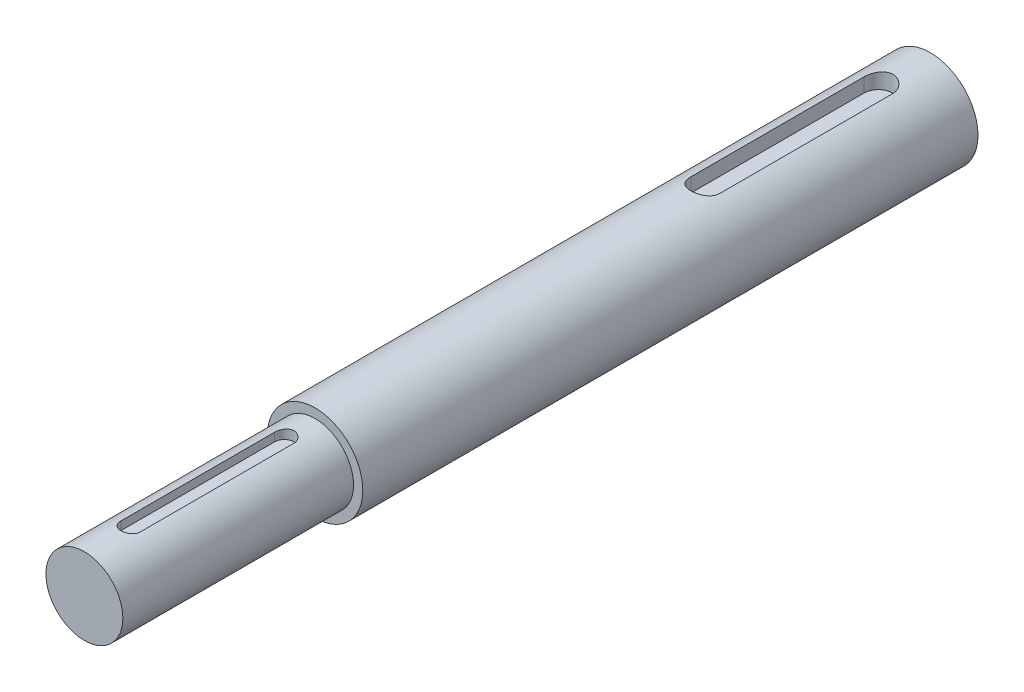
ISO-10303-21;
HEADER;
FILE_DESCRIPTION(('STEP AP214'),'2;1');
FILE_NAME('part.step','',(''),(''),'','','');
FILE_SCHEMA(('AUTOMOTIVE_DESIGN { 1 0 10303 214 1 1 1 1 }'));
ENDSEC;
DATA;
#1=APPLICATION_CONTEXT('core data for automotive mechanical design processes');
#2=APPLICATION_PROTOCOL_DEFINITION('international standard','automotive_design',2000,#1);
#3=PRODUCT_CONTEXT('',#1,'mechanical');
#4=PRODUCT('Part','Part','',(#3));
#5=PRODUCT_RELATED_PRODUCT_CATEGORY('part','',(#4));
#6=PRODUCT_DEFINITION_FORMATION('','',#4);
#7=PRODUCT_DEFINITION_CONTEXT('part definition',#1,'design');
#8=PRODUCT_DEFINITION('design','',#6,#7);
#9=PRODUCT_DEFINITION_SHAPE('','',#8);
#10=(LENGTH_UNIT() NAMED_UNIT(*) SI_UNIT(.MILLI.,.METRE.));
#11=(NAMED_UNIT(*) PLANE_ANGLE_UNIT() SI_UNIT($,.RADIAN.));
#12=(NAMED_UNIT(*) SI_UNIT($,.STERADIAN.) SOLID_ANGLE_UNIT());
#13=UNCERTAINTY_MEASURE_WITH_UNIT(LENGTH_MEASURE(1.E-05),#10,'distance_accuracy_value','');
#14=(GEOMETRIC_REPRESENTATION_CONTEXT(3) GLOBAL_UNCERTAINTY_ASSIGNED_CONTEXT((#13)) GLOBAL_UNIT_ASSIGNED_CONTEXT((#10,
#11,#12)) REPRESENTATION_CONTEXT('',''));
#15=CARTESIAN_POINT('',(0.,0.,0.));
#16=DIRECTION('',(0.,0.,1.));
#17=DIRECTION('',(1.,0.,0.));
#18=AXIS2_PLACEMENT_3D('',#15,#16,#17);
#19=CARTESIAN_POINT('',(0.,0.,101.6));
#20=DIRECTION('',(0.,0.,1.));
#21=DIRECTION('',(1.,0.,0.));
#22=AXIS2_PLACEMENT_3D('',#19,#20,#21);
#23=PLANE('',#22);
#24=CARTESIAN_POINT('',(0.,0.,101.6));
#25=DIRECTION('',(0.,0.,1.));
#26=DIRECTION('',(1.,0.,0.));
#27=AXIS2_PLACEMENT_3D('',#24,#25,#26);
#28=CIRCLE('',#27,7.874);
#29=CARTESIAN_POINT('',(7.874,0.,101.6));
#30=VERTEX_POINT('',#29);
#31=EDGE_CURVE('E160',#30,#30,#28,.T.);
#32=ORIENTED_EDGE('',*,*,#31,.T.);
#33=EDGE_LOOP('',(#32));
#34=FACE_BOUND('',#33,.T.);
#35=CARTESIAN_POINT('',(0.,0.,101.6));
#36=DIRECTION('',(0.,0.,1.));
#37=DIRECTION('',(1.,0.,0.));
#38=AXIS2_PLACEMENT_3D('',#35,#36,#37);
#39=CIRCLE('',#38,6.35);
#40=CARTESIAN_POINT('',(6.35,0.,101.6));
#41=VERTEX_POINT('',#40);
#42=EDGE_CURVE('E146',#41,#41,#39,.T.);
#43=ORIENTED_EDGE('',*,*,#42,.F.);
#44=EDGE_LOOP('',(#43));
#45=FACE_BOUND('',#44,.T.);
#46=ADVANCED_FACE('F33',(#34,#45),#23,.T.);
#47=CARTESIAN_POINT('',(0.,0.,101.6));
#48=DIRECTION('',(0.,0.,-1.));
#49=DIRECTION('',(-1.,0.,0.));
#50=AXIS2_PLACEMENT_3D('',#47,#48,#49);
#51=CYLINDRICAL_SURFACE('',#50,7.874);
#52=DIRECTION('',(0.,0.,-1.));
#53=VECTOR('',#52,1.);
#54=CARTESIAN_POINT('',(2.38760000000002,7.50328209785557,101.6));
#55=LINE('',#54,#53);
#56=CARTESIAN_POINT('',(2.38759999999999,7.50328209785557,8.57249999999998));
#57=VERTEX_POINT('',#56);
#58=CARTESIAN_POINT('',(2.3876,7.50328209785558,37.1475));
#59=VERTEX_POINT('',#58);
#60=EDGE_CURVE('E11',#57,#59,#55,.F.);
#61=ORIENTED_EDGE('',*,*,#60,.T.);
#62=CARTESIAN_POINT('',(2.3876,7.50328209785558,37.1475));
#63=CARTESIAN_POINT('',(2.38760821779032,7.50327284946534,37.2129924714623));
#64=CARTESIAN_POINT('',(2.38490544614134,7.5041393624445,37.2784796496773));
#65=CARTESIAN_POINT('',(2.37414186540394,7.50755516864404,37.4089534418565));
#66=CARTESIAN_POINT('',(2.36608228287681,7.51010407664164,37.4739401669656));
#67=CARTESIAN_POINT('',(2.34469646720921,7.51680736926332,37.6027878106993));
#68=CARTESIAN_POINT('',(2.33138381426518,7.52095761351674,37.6666511921733));
#69=CARTESIAN_POINT('',(2.29962310182442,7.53072930011945,37.7929560306487));
#70=CARTESIAN_POINT('',(2.28117490339136,7.53635078227114,37.8553974491311));
#71=CARTESIAN_POINT('',(2.21835513085229,7.55517779820655,38.0398958520454));
#72=CARTESIAN_POINT('',(2.16648047466429,7.57035520969243,38.1592932697437));
#73=CARTESIAN_POINT('',(2.04435037749231,7.60424223178625,38.3876922119953));
#74=CARTESIAN_POINT('',(1.97408612947307,7.6229535336257,38.4966887211836));
#75=CARTESIAN_POINT('',(1.81474110290773,7.6624740662912,38.7047415044754));
#76=CARTESIAN_POINT('',(1.72517203325727,7.68332851772332,38.8034159634566));
#77=CARTESIAN_POINT('',(1.53080549797222,7.72440052707145,38.984597829673));
#78=CARTESIAN_POINT('',(1.42600545305172,7.74461797640748,39.0671024930693));
#79=CARTESIAN_POINT('',(1.20140886411411,7.78265489473308,39.2152821923166));
#80=CARTESIAN_POINT('',(1.08134180176678,7.80041453439081,39.2805639485937));
#81=CARTESIAN_POINT('',(0.831308531995584,7.83100487402252,39.3898564593624));
#82=CARTESIAN_POINT('',(0.701344930688997,7.84383686628277,39.4338727915406));
#83=CARTESIAN_POINT('',(0.439227328358014,7.86280549607662,39.4981139389448));
#84=CARTESIAN_POINT('',(0.307247848406049,7.86912654438449,39.5189953920645));
#85=CARTESIAN_POINT('',(0.0415147230335115,7.87501105265659,39.5384514277847));
#86=CARTESIAN_POINT('',(-0.0922385734955804,7.87457582237881,39.5370303339095));
#87=CARTESIAN_POINT('',(-0.353106910261381,7.8671263990307,39.512359288386));
#88=CARTESIAN_POINT('',(-0.48029634865324,7.86032670086981,39.489821001924));
#89=CARTESIAN_POINT('',(-0.728992966857808,7.84117397116764,39.4247194938228));
#90=CARTESIAN_POINT('',(-0.850499846446754,7.82882064657952,39.3821552154715));
#91=CARTESIAN_POINT('',(-1.08606389447679,7.79965423557936,39.2777340502286));
#92=CARTESIAN_POINT('',(-1.20001608333464,7.78279018170079,39.2156551636257));
#93=CARTESIAN_POINT('',(-1.41611043440809,7.74638835600327,39.0741435906152));
#94=CARTESIAN_POINT('',(-1.51824988611004,7.72684997277789,38.9947069333819));
#95=CARTESIAN_POINT('',(-1.71205771472304,7.68628183698156,38.8170633649683));
#96=CARTESIAN_POINT('',(-1.80315767254702,7.66522364844163,38.7182420461265));
#97=CARTESIAN_POINT('',(-1.96767319770508,7.62465334817369,38.5064967796336));
#98=CARTESIAN_POINT('',(-2.04108356572079,7.60514169213007,38.3935687005009));
#99=CARTESIAN_POINT('',(-2.16875591718525,7.56973083959693,38.1552699542136));
#100=CARTESIAN_POINT('',(-2.22280884240702,7.55387170695431,38.0297811356253));
#101=CARTESIAN_POINT('',(-2.30877939213989,7.52804501355559,37.7709556554203));
#102=CARTESIAN_POINT('',(-2.34073095666729,7.51806842275062,37.6376313695369));
#103=CARTESIAN_POINT('',(-2.36989271220025,7.50889812752312,37.4437961254711));
#104=CARTESIAN_POINT('',(-2.376531989946,7.50679688788015,37.3847089971823));
#105=CARTESIAN_POINT('',(-2.38538176350181,7.50398861531597,37.266257954231));
#106=CARTESIAN_POINT('',(-2.38759870904082,7.50327955200574,37.2068945694086));
#107=CARTESIAN_POINT('',(-2.3876,7.50328209785558,37.1475));
#108=B_SPLINE_CURVE_WITH_KNOTS('',3,(#62,#63,#64,#65,#66,#67,#68,#69,#70,#71,#72,#73,#74,#75,
#76,#77,#78,#79,#80,#81,#82,#83,#84,#85,#86,#87,#88,#89,#90,#91,#92,#93,#94,#95,#96,#97,#98,#99,
#100,#101,#102,#103,#104,#105,#106,#107),.UNSPECIFIED.,.F.,.F.,(4,2,2,2,2,2,2,2,2,2,2,2,2,2,2,2,
2,2,2,2,2,2,4),(0.,0.196406928499266,0.392768900738741,0.588626530802149,0.784489460085461,
1.17571508325446,1.56712841384515,1.96993799986685,2.3728158792385,2.78422308642458,
3.19552232737019,3.59482217970918,3.99404462558367,4.38027911524776,4.76653398764498,
5.15735244591579,5.54826040299026,5.95451312940004,6.36088511622918,6.77152217630764,
7.18152723204413,7.35986407938129,7.53794064148895),.UNSPECIFIED.);
#109=CARTESIAN_POINT('',(-2.3876,7.50328209785558,37.1475));
#110=VERTEX_POINT('',#109);
#111=EDGE_CURVE('E315',#59,#110,#108,.T.);
#112=ORIENTED_EDGE('',*,*,#111,.T.);
#113=DIRECTION('',(0.,0.,-1.));
#114=VECTOR('',#113,1.);
#115=CARTESIAN_POINT('',(-2.38759999999998,7.50328209785558,101.6));
#116=LINE('',#115,#114);
#117=CARTESIAN_POINT('',(-2.38759999999998,7.50328209785558,8.57249999999998));
#118=VERTEX_POINT('',#117);
#119=EDGE_CURVE('E42',#110,#118,#116,.T.);
#120=ORIENTED_EDGE('',*,*,#119,.T.);
#121=CARTESIAN_POINT('',(-2.38760000000001,7.50328209785557,8.57249999999998));
#122=CARTESIAN_POINT('',(-2.38760821779033,7.50327284946534,8.5070075285377));
#123=CARTESIAN_POINT('',(-2.38490544614134,7.5041393624445,8.44152035032272));
#124=CARTESIAN_POINT('',(-2.37414186540394,7.50755516864404,8.31104655814348));
#125=CARTESIAN_POINT('',(-2.36608228287682,7.51010407664164,8.24605983303435));
#126=CARTESIAN_POINT('',(-2.34469646720921,7.51680736926332,8.11721218930066));
#127=CARTESIAN_POINT('',(-2.33138381426518,7.52095761351674,8.05334880782671));
#128=CARTESIAN_POINT('',(-2.29962310182442,7.53072930011945,7.92704396935129));
#129=CARTESIAN_POINT('',(-2.28117490339136,7.53635078227114,7.86460255086886));
#130=CARTESIAN_POINT('',(-2.21835513085229,7.55517779820655,7.68010414795462));
#131=CARTESIAN_POINT('',(-2.16648047466429,7.57035520969243,7.56070673025631));
#132=CARTESIAN_POINT('',(-2.04435037749231,7.60424223178625,7.33230778800467));
#133=CARTESIAN_POINT('',(-1.97408612947307,7.6229535336257,7.22331127881639));
#134=CARTESIAN_POINT('',(-1.81474110290773,7.6624740662912,7.01525849552461));
#135=CARTESIAN_POINT('',(-1.72517203325727,7.68332851772332,6.91658403654341));
#136=CARTESIAN_POINT('',(-1.53080549797222,7.72440052707145,6.73540217032696));
#137=CARTESIAN_POINT('',(-1.42600545305172,7.74461797640748,6.65289750693067));
#138=CARTESIAN_POINT('',(-1.20140886411411,7.78265489473308,6.50471780768338));
#139=CARTESIAN_POINT('',(-1.08134180176678,7.80041453439081,6.43943605140633));
#140=CARTESIAN_POINT('',(-0.831308531995584,7.83100487402252,6.33014354063757));
#141=CARTESIAN_POINT('',(-0.701344930688998,7.84383686628277,6.28612720845938));
#142=CARTESIAN_POINT('',(-0.439227328358016,7.86280549607661,6.22188606105516));
#143=CARTESIAN_POINT('',(-0.30724784840605,7.86912654438448,6.20100460793547));
#144=CARTESIAN_POINT('',(-0.0415147230335111,7.87501105265659,6.18154857221531));
#145=CARTESIAN_POINT('',(0.0922385734955813,7.87457582237881,6.18296966609048));
#146=CARTESIAN_POINT('',(0.353106910261383,7.8671263990307,6.20764071161396));
#147=CARTESIAN_POINT('',(0.480296348653242,7.86032670086981,6.23017899807601));
#148=CARTESIAN_POINT('',(0.728992966857811,7.84117397116764,6.2952805061772));
#149=CARTESIAN_POINT('',(0.850499846446756,7.82882064657952,6.33784478452847));
#150=CARTESIAN_POINT('',(1.08606389447679,7.79965423557936,6.44226594977135));
#151=CARTESIAN_POINT('',(1.20001608333464,7.78279018170079,6.50434483637425));
#152=CARTESIAN_POINT('',(1.41611043440809,7.74638835600327,6.64585640938477));
#153=CARTESIAN_POINT('',(1.51824988611004,7.72684997277789,6.7252930666181));
#154=CARTESIAN_POINT('',(1.71205771472304,7.68628183698156,6.9029366350317));
#155=CARTESIAN_POINT('',(1.80315767254702,7.66522364844163,7.00175795387353));
#156=CARTESIAN_POINT('',(1.96767319770508,7.62465334817369,7.21350322036644));
#157=CARTESIAN_POINT('',(2.04108356572079,7.60514169213007,7.3264312994991));
#158=CARTESIAN_POINT('',(2.16875591718525,7.56973083959693,7.56473004578639));
#159=CARTESIAN_POINT('',(2.22280884240701,7.55387170695431,7.69021886437468));
#160=CARTESIAN_POINT('',(2.30877939213989,7.52804501355559,7.94904434457964));
#161=CARTESIAN_POINT('',(2.34073095666728,7.51806842275062,8.0823686304631));
#162=CARTESIAN_POINT('',(2.36989271220025,7.50889812752312,8.27620387452891));
#163=CARTESIAN_POINT('',(2.376531989946,7.50679688788016,8.33529100281767));
#164=CARTESIAN_POINT('',(2.38538176350181,7.50398861531597,8.453742045769));
#165=CARTESIAN_POINT('',(2.38759870904081,7.50327955200574,8.51310543059142));
#166=CARTESIAN_POINT('',(2.38759999999999,7.50328209785558,8.57249999999998));
#167=B_SPLINE_CURVE_WITH_KNOTS('',3,(#121,#122,#123,#124,#125,#126,#127,#128,#129,#130,#131,
#132,#133,#134,#135,#136,#137,#138,#139,#140,#141,#142,#143,#144,#145,#146,#147,#148,#149,#150,
#151,#152,#153,#154,#155,#156,#157,#158,#159,#160,#161,#162,#163,#164,#165,#166),.UNSPECIFIED.,
.F.,.F.,(4,2,2,2,2,2,2,2,2,2,2,2,2,2,2,2,2,2,2,2,2,2,4),(0.,0.196406928499268,0.392768900738746,
0.58862653080216,0.784489460085466,1.17571508325447,1.56712841384515,1.96993799986685,
2.3728158792385,2.78422308642458,3.19552232737019,3.59482217970918,3.99404462558367,
4.38027911524776,4.76653398764499,5.1573524459158,5.54826040299027,5.95451312940005,
6.36088511622918,6.77152217630764,7.18152723204413,7.35986407938129,7.53794064148895),.UNSPECIFIED.);
#168=EDGE_CURVE('E49',#118,#57,#167,.T.);
#169=ORIENTED_EDGE('',*,*,#168,.T.);
#170=EDGE_LOOP('',(#61,#112,#120,#169));
#171=FACE_BOUND('',#170,.T.);
#172=ORIENTED_EDGE('',*,*,#31,.F.);
#173=EDGE_LOOP('',(#172));
#174=FACE_BOUND('',#173,.T.);
#175=CARTESIAN_POINT('',(0.,0.,0.));
#176=DIRECTION('',(0.,0.,1.));
#177=DIRECTION('',(1.,0.,0.));
#178=AXIS2_PLACEMENT_3D('',#175,#176,#177);
#179=CIRCLE('',#178,7.874);
#180=CARTESIAN_POINT('',(7.874,0.,0.));
#181=VERTEX_POINT('',#180);
#182=EDGE_CURVE('E157',#181,#181,#179,.T.);
#183=ORIENTED_EDGE('',*,*,#182,.T.);
#184=EDGE_LOOP('',(#183));
#185=FACE_BOUND('',#184,.T.);
#186=ADVANCED_FACE('F35',(#171,#174,#185),#51,.T.);
#187=CARTESIAN_POINT('',(0.,0.,0.));
#188=DIRECTION('',(0.,0.,1.));
#189=DIRECTION('',(1.,0.,0.));
#190=AXIS2_PLACEMENT_3D('',#187,#188,#189);
#191=PLANE('',#190);
#192=ORIENTED_EDGE('',*,*,#182,.F.);
#193=EDGE_LOOP('',(#192));
#194=FACE_BOUND('',#193,.T.);
#195=ADVANCED_FACE('F203',(#194),#191,.F.);
#196=CARTESIAN_POINT('',(0.,0.,139.7));
#197=DIRECTION('',(0.,0.,-1.));
#198=DIRECTION('',(-1.,0.,0.));
#199=AXIS2_PLACEMENT_3D('',#196,#197,#198);
#200=CYLINDRICAL_SURFACE('',#199,6.35);
#201=DIRECTION('',(0.,0.,-1.));
#202=VECTOR('',#201,1.);
#203=CARTESIAN_POINT('',(1.58750000000001,6.14836106210427,139.7));
#204=LINE('',#203,#202);
#205=CARTESIAN_POINT('',(1.5875,6.14836106210427,106.68));
#206=VERTEX_POINT('',#205);
#207=CARTESIAN_POINT('',(1.5875,6.14836106210427,132.08));
#208=VERTEX_POINT('',#207);
#209=EDGE_CURVE('E322',#206,#208,#204,.F.);
#210=ORIENTED_EDGE('',*,*,#209,.T.);
#211=CARTESIAN_POINT('',(1.5875,6.14836106210427,132.08));
#212=CARTESIAN_POINT('',(1.58750053577508,6.14835810871031,132.123914988857));
#213=CARTESIAN_POINT('',(1.5856766092084,6.14883215794785,132.167808217541));
#214=CARTESIAN_POINT('',(1.57840568144076,6.15070373829612,132.255266406044));
#215=CARTESIAN_POINT('',(1.57295928989663,6.15210111401178,132.298831419853));
#216=CARTESIAN_POINT('',(1.55126569251976,6.15762216168135,132.428381912469));
#217=CARTESIAN_POINT('',(1.52966371608634,6.16307509998734,132.513477143715));
#218=CARTESIAN_POINT('',(1.4728794460437,6.17688983358454,132.678685419629));
#219=CARTESIAN_POINT('',(1.43769842861035,6.18525135551601,132.758798931663));
#220=CARTESIAN_POINT('',(1.35479691261607,6.20393625974203,132.912026924728));
#221=CARTESIAN_POINT('',(1.30707305157914,6.21426016790589,132.985139521777));
#222=CARTESIAN_POINT('',(1.19933159902707,6.23595816556865,133.123850912526));
#223=CARTESIAN_POINT('',(1.13909041419458,6.24734893258403,133.189273381915));
#224=CARTESIAN_POINT('',(1.00850030156954,6.26975353228957,133.309204567054));
#225=CARTESIAN_POINT('',(0.938149761172665,6.28076730449527,133.36371153828));
#226=CARTESIAN_POINT('',(0.788125327800202,6.30136189374656,133.46098371507));
#227=CARTESIAN_POINT('',(0.708335102780995,6.31092058682246,133.503574584875));
#228=CARTESIAN_POINT('',(0.542452862963151,6.32733599672809,133.574670515537));
#229=CARTESIAN_POINT('',(0.456362092231793,6.33419324527087,133.603178348576));
#230=CARTESIAN_POINT('',(0.282168772283708,6.34431516258141,133.644733651034));
#231=CARTESIAN_POINT('',(0.194142236179555,6.34764975230815,133.658082429971));
#232=CARTESIAN_POINT('',(0.0170382813946867,6.3505943306442,133.669886602325));
#233=CARTESIAN_POINT('',(-0.0720390037955496,6.35020478739593,133.66834386768));
#234=CARTESIAN_POINT('',(-0.246622082593184,6.34579689318106,133.650624932649));
#235=CARTESIAN_POINT('',(-0.332163264012003,6.3418592790031,133.634774296148));
#236=CARTESIAN_POINT('',(-0.499330203846373,6.33089174885437,133.589412971797));
#237=CARTESIAN_POINT('',(-0.58095578884806,6.3238616960657,133.55990167956));
#238=CARTESIAN_POINT('',(-0.738834066563934,6.30737558946855,133.487792966935));
#239=CARTESIAN_POINT('',(-0.815031436993547,6.29789815201245,133.445079511655));
#240=CARTESIAN_POINT('',(-0.959289152077628,6.27754563547797,133.347867781389));
#241=CARTESIAN_POINT('',(-1.02734826845511,6.26667034593953,133.293367730973));
#242=CARTESIAN_POINT('',(-1.15533390616221,6.24436086061299,133.172392227071));
#243=CARTESIAN_POINT('',(-1.21499170109841,6.23291950133326,133.105633526993));
#244=CARTESIAN_POINT('',(-1.32233920060813,6.21103292150861,132.962920086252));
#245=CARTESIAN_POINT('',(-1.37002562901402,6.20058797413252,132.886962836662));
#246=CARTESIAN_POINT('',(-1.45225247599145,6.18184904068292,132.727468863455));
#247=CARTESIAN_POINT('',(-1.48672076589603,6.17356693289505,132.643893549477));
#248=CARTESIAN_POINT('',(-1.54098998356159,6.160247058562,132.471926876136));
#249=CARTESIAN_POINT('',(-1.56081283787425,6.15520444346279,132.38354292995));
#250=CARTESIAN_POINT('',(-1.5778236083021,6.1508527395692,132.258661408045));
#251=CARTESIAN_POINT('',(-1.58145288065964,6.1499198043849,132.223002471149));
#252=CARTESIAN_POINT('',(-1.58628835284461,6.14867424201247,132.151568008519));
#253=CARTESIAN_POINT('',(-1.58749847297747,6.14836061123394,132.115792765671));
#254=CARTESIAN_POINT('',(-1.5875,6.14836106210428,132.08));
#255=B_SPLINE_CURVE_WITH_KNOTS('',3,(#211,#212,#213,#214,#215,#216,#217,#218,#219,#220,#221,
#222,#223,#224,#225,#226,#227,#228,#229,#230,#231,#232,#233,#234,#235,#236,#237,#238,#239,#240,
#241,#242,#243,#244,#245,#246,#247,#248,#249,#250,#251,#252,#253,#254),.UNSPECIFIED.,.F.,.F.,(4,
2,2,2,2,2,2,2,2,2,2,2,2,2,2,2,2,2,2,2,2,4),(0.,0.131661741914362,0.263301330909383,
0.525827566389991,0.788329135320231,1.0509011473787,1.31864401216689,1.58642963374344,
1.85794947018447,2.12941583787723,2.39538639405577,2.66132351682413,2.92135790948349,
3.18140380792891,3.4438035875247,3.7062429203087,3.97575769386084,4.24534614449784,
4.51638543255692,4.78701810469725,4.89451409847199,5.00183575024028),.UNSPECIFIED.);
#256=CARTESIAN_POINT('',(-1.5875,6.14836106210428,132.08));
#257=VERTEX_POINT('',#256);
#258=EDGE_CURVE('E163',#208,#257,#255,.T.);
#259=ORIENTED_EDGE('',*,*,#258,.T.);
#260=DIRECTION('',(0.,0.,-1.));
#261=VECTOR('',#260,1.);
#262=CARTESIAN_POINT('',(-1.58749999999999,6.14836106210428,139.7));
#263=LINE('',#262,#261);
#264=CARTESIAN_POINT('',(-1.58749999999999,6.14836106210428,106.68));
#265=VERTEX_POINT('',#264);
#266=EDGE_CURVE('E330',#257,#265,#263,.T.);
#267=ORIENTED_EDGE('',*,*,#266,.T.);
#268=CARTESIAN_POINT('',(-1.5875,6.14836106210427,106.68));
#269=CARTESIAN_POINT('',(-1.58750053577508,6.14835810871031,106.636085011143));
#270=CARTESIAN_POINT('',(-1.5856766092084,6.14883215794785,106.592191782459));
#271=CARTESIAN_POINT('',(-1.57840568144076,6.15070373829612,106.504733593956));
#272=CARTESIAN_POINT('',(-1.57295928989663,6.15210111401178,106.461168580147));
#273=CARTESIAN_POINT('',(-1.55126569251976,6.15762216168135,106.331618087531));
#274=CARTESIAN_POINT('',(-1.52966371608633,6.16307509998734,106.246522856284));
#275=CARTESIAN_POINT('',(-1.4728794460437,6.17688983358454,106.081314580371));
#276=CARTESIAN_POINT('',(-1.43769842861034,6.18525135551601,106.001201068337));
#277=CARTESIAN_POINT('',(-1.35479691261606,6.20393625974203,105.847973075272));
#278=CARTESIAN_POINT('',(-1.30707305157913,6.21426016790589,105.774860478223));
#279=CARTESIAN_POINT('',(-1.19933159902705,6.23595816556865,105.636149087474));
#280=CARTESIAN_POINT('',(-1.13909041419456,6.24734893258404,105.570726618085));
#281=CARTESIAN_POINT('',(-1.00850030156952,6.26975353228957,105.450795432946));
#282=CARTESIAN_POINT('',(-0.93814976117265,6.28076730449528,105.39628846172));
#283=CARTESIAN_POINT('',(-0.788125327800193,6.30136189374656,105.29901628493));
#284=CARTESIAN_POINT('',(-0.708335102780985,6.31092058682247,105.256425415125));
#285=CARTESIAN_POINT('',(-0.542452862963138,6.3273359967281,105.185329484463));
#286=CARTESIAN_POINT('',(-0.456362092231778,6.33419324527088,105.156821651424));
#287=CARTESIAN_POINT('',(-0.282168772283687,6.34431516258141,105.115266348966));
#288=CARTESIAN_POINT('',(-0.194142236179532,6.34764975230815,105.101917570029));
#289=CARTESIAN_POINT('',(-0.0170382813946634,6.3505943306442,105.090113397675));
#290=CARTESIAN_POINT('',(0.0720390037955722,6.35020478739593,105.09165613232));
#291=CARTESIAN_POINT('',(0.246622082593204,6.34579689318106,105.109375067351));
#292=CARTESIAN_POINT('',(0.332163264012021,6.3418592790031,105.125225703852));
#293=CARTESIAN_POINT('',(0.499330203846391,6.33089174885437,105.170587028203));
#294=CARTESIAN_POINT('',(0.580955788848081,6.3238616960657,105.20009832044));
#295=CARTESIAN_POINT('',(0.738834066563961,6.30737558946855,105.272207033065));
#296=CARTESIAN_POINT('',(0.81503143699358,6.29789815201244,105.314920488345));
#297=CARTESIAN_POINT('',(0.959289152077658,6.27754563547797,105.412132218611));
#298=CARTESIAN_POINT('',(1.02734826845514,6.26667034593952,105.466632269027));
#299=CARTESIAN_POINT('',(1.15533390616223,6.24436086061299,105.587607772929));
#300=CARTESIAN_POINT('',(1.21499170109843,6.23291950133326,105.654366473007));
#301=CARTESIAN_POINT('',(1.32233920060815,6.2110329215086,105.797079913748));
#302=CARTESIAN_POINT('',(1.37002562901404,6.20058797413252,105.873037163338));
#303=CARTESIAN_POINT('',(1.45225247599146,6.18184904068291,106.032531136545));
#304=CARTESIAN_POINT('',(1.48672076589604,6.17356693289505,106.116106450523));
#305=CARTESIAN_POINT('',(1.5409899835616,6.160247058562,106.288073123864));
#306=CARTESIAN_POINT('',(1.56081283787426,6.15520444346279,106.37645707005));
#307=CARTESIAN_POINT('',(1.57782360830211,6.1508527395692,106.501338591955));
#308=CARTESIAN_POINT('',(1.58145288065965,6.1499198043849,106.536997528851));
#309=CARTESIAN_POINT('',(1.58628835284461,6.14867424201247,106.608431991481));
#310=CARTESIAN_POINT('',(1.58749847297747,6.14836061123394,106.644207234329));
#311=CARTESIAN_POINT('',(1.5875,6.14836106210428,106.68));
#312=B_SPLINE_CURVE_WITH_KNOTS('',3,(#268,#269,#270,#271,#272,#273,#274,#275,#276,#277,#278,
#279,#280,#281,#282,#283,#284,#285,#286,#287,#288,#289,#290,#291,#292,#293,#294,#295,#296,#297,
#298,#299,#300,#301,#302,#303,#304,#305,#306,#307,#308,#309,#310,#311),.UNSPECIFIED.,.F.,.F.,(4,
2,2,2,2,2,2,2,2,2,2,2,2,2,2,2,2,2,2,2,2,4),(0.,0.131661741914404,0.263301330909397,
0.525827566390006,0.788329135320261,1.05090114737873,1.31864401216691,1.58642963374346,
1.85794947018447,2.12941583787724,2.39538639405578,2.66132351682414,2.9213579094835,
3.18140380792893,3.44380358752474,3.70624292030872,3.97575769386086,4.24534614449787,
4.51638543255695,4.78701810469728,4.89451409847204,5.00183575024028),.UNSPECIFIED.);
#313=EDGE_CURVE('E57',#265,#206,#312,.T.);
#314=ORIENTED_EDGE('',*,*,#313,.T.);
#315=EDGE_LOOP('',(#210,#259,#267,#314));
#316=FACE_BOUND('',#315,.T.);
#317=CARTESIAN_POINT('',(0.,0.,139.7));
#318=DIRECTION('',(0.,0.,1.));
#319=DIRECTION('',(1.,0.,0.));
#320=AXIS2_PLACEMENT_3D('',#317,#318,#319);
#321=CIRCLE('',#320,6.35);
#322=CARTESIAN_POINT('',(6.35,0.,139.7));
#323=VERTEX_POINT('',#322);
#324=EDGE_CURVE('E154',#323,#323,#321,.T.);
#325=ORIENTED_EDGE('',*,*,#324,.F.);
#326=EDGE_LOOP('',(#325));
#327=FACE_BOUND('',#326,.T.);
#328=ORIENTED_EDGE('',*,*,#42,.T.);
#329=EDGE_LOOP('',(#328));
#330=FACE_BOUND('',#329,.T.);
#331=ADVANCED_FACE('F178',(#316,#327,#330),#200,.T.);
#332=CARTESIAN_POINT('',(0.,0.,139.7));
#333=DIRECTION('',(0.,0.,1.));
#334=DIRECTION('',(1.,0.,0.));
#335=AXIS2_PLACEMENT_3D('',#332,#333,#334);
#336=PLANE('',#335);
#337=ORIENTED_EDGE('',*,*,#324,.T.);
#338=EDGE_LOOP('',(#337));
#339=FACE_BOUND('',#338,.T.);
#340=ADVANCED_FACE('F197',(#339),#336,.T.);
#341=CARTESIAN_POINT('',(0.,4.7625,106.68));
#342=DIRECTION('',(0.,1.,0.));
#343=DIRECTION('',(-1.,0.,0.));
#344=AXIS2_PLACEMENT_3D('',#341,#342,#343);
#345=CYLINDRICAL_SURFACE('',#344,1.5875);
#346=DIRECTION('',(0.,1.,0.));
#347=VECTOR('',#346,1.);
#348=CARTESIAN_POINT('',(-1.5875,4.7625,106.68));
#349=LINE('',#348,#347);
#350=CARTESIAN_POINT('',(-1.5875,4.7625,106.68));
#351=VERTEX_POINT('',#350);
#352=EDGE_CURVE('E143',#351,#265,#349,.T.);
#353=ORIENTED_EDGE('',*,*,#352,.F.);
#354=CARTESIAN_POINT('',(0.,4.7625,106.68));
#355=DIRECTION('',(0.,1.,0.));
#356=DIRECTION('',(-1.,0.,0.));
#357=AXIS2_PLACEMENT_3D('',#354,#355,#356);
#358=CIRCLE('',#357,1.5875);
#359=CARTESIAN_POINT('',(1.5875,4.7625,106.68));
#360=VERTEX_POINT('',#359);
#361=EDGE_CURVE('E127',#360,#351,#358,.T.);
#362=ORIENTED_EDGE('',*,*,#361,.F.);
#363=DIRECTION('',(0.,1.,0.));
#364=VECTOR('',#363,1.);
#365=CARTESIAN_POINT('',(1.5875,4.7625,106.68));
#366=LINE('',#365,#364);
#367=EDGE_CURVE('E144',#360,#206,#366,.T.);
#368=ORIENTED_EDGE('',*,*,#367,.T.);
#369=ORIENTED_EDGE('',*,*,#313,.F.);
#370=EDGE_LOOP('',(#353,#362,#368,#369));
#371=FACE_BOUND('',#370,.T.);
#372=ADVANCED_FACE('F194',(#371),#345,.F.);
#373=CARTESIAN_POINT('',(1.5875,4.7625,106.68));
#374=DIRECTION('',(1.,0.,0.));
#375=DIRECTION('',(0.,0.,-1.));
#376=AXIS2_PLACEMENT_3D('',#373,#374,#375);
#377=PLANE('',#376);
#378=ORIENTED_EDGE('',*,*,#367,.F.);
#379=DIRECTION('',(0.,0.,-1.));
#380=VECTOR('',#379,1.);
#381=CARTESIAN_POINT('',(1.5875,4.7625,106.68));
#382=LINE('',#381,#380);
#383=CARTESIAN_POINT('',(1.5875,4.7625,132.08));
#384=VERTEX_POINT('',#383);
#385=EDGE_CURVE('E140',#384,#360,#382,.T.);
#386=ORIENTED_EDGE('',*,*,#385,.F.);
#387=DIRECTION('',(0.,1.,0.));
#388=VECTOR('',#387,1.);
#389=CARTESIAN_POINT('',(1.5875,4.7625,132.08));
#390=LINE('',#389,#388);
#391=EDGE_CURVE('E147',#384,#208,#390,.T.);
#392=ORIENTED_EDGE('',*,*,#391,.T.);
#393=ORIENTED_EDGE('',*,*,#209,.F.);
#394=EDGE_LOOP('',(#378,#386,#392,#393));
#395=FACE_BOUND('',#394,.T.);
#396=ADVANCED_FACE('F188',(#395),#377,.F.);
#397=CARTESIAN_POINT('',(0.,4.7625,132.08));
#398=DIRECTION('',(0.,1.,0.));
#399=DIRECTION('',(-1.,0.,0.));
#400=AXIS2_PLACEMENT_3D('',#397,#398,#399);
#401=CYLINDRICAL_SURFACE('',#400,1.5875);
#402=ORIENTED_EDGE('',*,*,#391,.F.);
#403=CARTESIAN_POINT('',(0.,4.7625,132.08));
#404=DIRECTION('',(0.,1.,0.));
#405=DIRECTION('',(-1.,0.,0.));
#406=AXIS2_PLACEMENT_3D('',#403,#404,#405);
#407=CIRCLE('',#406,1.5875);
#408=CARTESIAN_POINT('',(-1.5875,4.7625,132.08));
#409=VERTEX_POINT('',#408);
#410=EDGE_CURVE('E137',#409,#384,#407,.T.);
#411=ORIENTED_EDGE('',*,*,#410,.F.);
#412=DIRECTION('',(0.,1.,0.));
#413=VECTOR('',#412,1.);
#414=CARTESIAN_POINT('',(-1.5875,4.7625,132.08));
#415=LINE('',#414,#413);
#416=EDGE_CURVE('E150',#409,#257,#415,.T.);
#417=ORIENTED_EDGE('',*,*,#416,.T.);
#418=ORIENTED_EDGE('',*,*,#258,.F.);
#419=EDGE_LOOP('',(#402,#411,#417,#418));
#420=FACE_BOUND('',#419,.T.);
#421=ADVANCED_FACE('F182',(#420),#401,.F.);
#422=CARTESIAN_POINT('',(-1.5875,4.7625,106.68));
#423=DIRECTION('',(-1.,0.,0.));
#424=DIRECTION('',(0.,0.,1.));
#425=AXIS2_PLACEMENT_3D('',#422,#423,#424);
#426=PLANE('',#425);
#427=ORIENTED_EDGE('',*,*,#416,.F.);
#428=DIRECTION('',(0.,0.,1.));
#429=VECTOR('',#428,1.);
#430=CARTESIAN_POINT('',(-1.5875,4.7625,106.68));
#431=LINE('',#430,#429);
#432=EDGE_CURVE('E134',#351,#409,#431,.T.);
#433=ORIENTED_EDGE('',*,*,#432,.F.);
#434=ORIENTED_EDGE('',*,*,#352,.T.);
#435=ORIENTED_EDGE('',*,*,#266,.F.);
#436=EDGE_LOOP('',(#427,#433,#434,#435));
#437=FACE_BOUND('',#436,.T.);
#438=ADVANCED_FACE('F187',(#437),#426,.F.);
#439=CARTESIAN_POINT('',(0.,4.7625,106.68));
#440=DIRECTION('',(0.,1.,0.));
#441=DIRECTION('',(-1.,0.,0.));
#442=AXIS2_PLACEMENT_3D('',#439,#440,#441);
#443=PLANE('',#442);
#444=ORIENTED_EDGE('',*,*,#361,.T.);
#445=ORIENTED_EDGE('',*,*,#432,.T.);
#446=ORIENTED_EDGE('',*,*,#410,.T.);
#447=ORIENTED_EDGE('',*,*,#385,.T.);
#448=EDGE_LOOP('',(#444,#445,#446,#447));
#449=FACE_BOUND('',#448,.T.);
#450=ADVANCED_FACE('F192',(#449),#443,.T.);
#451=CARTESIAN_POINT('',(0.,5.1816,8.57249999999998));
#452=DIRECTION('',(0.,1.,0.));
#453=DIRECTION('',(-1.,0.,0.));
#454=AXIS2_PLACEMENT_3D('',#451,#452,#453);
#455=CYLINDRICAL_SURFACE('',#454,2.3876);
#456=DIRECTION('',(0.,1.,0.));
#457=VECTOR('',#456,1.);
#458=CARTESIAN_POINT('',(-2.38760000000001,5.1816,8.57249999999998));
#459=LINE('',#458,#457);
#460=CARTESIAN_POINT('',(-2.38760000000001,5.1816,8.57249999999998));
#461=VERTEX_POINT('',#460);
#462=EDGE_CURVE('E99',#461,#118,#459,.T.);
#463=ORIENTED_EDGE('',*,*,#462,.F.);
#464=CARTESIAN_POINT('',(0.,5.1816,8.57249999999998));
#465=DIRECTION('',(0.,1.,0.));
#466=DIRECTION('',(-1.,0.,0.));
#467=AXIS2_PLACEMENT_3D('',#464,#465,#466);
#468=CIRCLE('',#467,2.3876);
#469=CARTESIAN_POINT('',(2.38759999999999,5.1816,8.57249999999998));
#470=VERTEX_POINT('',#469);
#471=EDGE_CURVE('E103',#470,#461,#468,.T.);
#472=ORIENTED_EDGE('',*,*,#471,.F.);
#473=DIRECTION('',(0.,1.,0.));
#474=VECTOR('',#473,1.);
#475=CARTESIAN_POINT('',(2.38759999999999,5.1816,8.57249999999998));
#476=LINE('',#475,#474);
#477=EDGE_CURVE('E125',#470,#57,#476,.T.);
#478=ORIENTED_EDGE('',*,*,#477,.T.);
#479=ORIENTED_EDGE('',*,*,#168,.F.);
#480=EDGE_LOOP('',(#463,#472,#478,#479));
#481=FACE_BOUND('',#480,.T.);
#482=ADVANCED_FACE('F101',(#481),#455,.F.);
#483=CARTESIAN_POINT('',(2.38759999999999,5.1816,8.57249999999998));
#484=DIRECTION('',(1.,0.,0.));
#485=DIRECTION('',(0.,0.,-1.));
#486=AXIS2_PLACEMENT_3D('',#483,#484,#485);
#487=PLANE('',#486);
#488=ORIENTED_EDGE('',*,*,#477,.F.);
#489=DIRECTION('',(0.,0.,-1.));
#490=VECTOR('',#489,1.);
#491=CARTESIAN_POINT('',(2.38759999999999,5.1816,8.57249999999998));
#492=LINE('',#491,#490);
#493=CARTESIAN_POINT('',(2.3876,5.1816,37.1475));
#494=VERTEX_POINT('',#493);
#495=EDGE_CURVE('E108',#494,#470,#492,.T.);
#496=ORIENTED_EDGE('',*,*,#495,.F.);
#497=DIRECTION('',(0.,1.,0.));
#498=VECTOR('',#497,1.);
#499=CARTESIAN_POINT('',(2.3876,5.1816,37.1475));
#500=LINE('',#499,#498);
#501=EDGE_CURVE('E128',#494,#59,#500,.T.);
#502=ORIENTED_EDGE('',*,*,#501,.T.);
#503=ORIENTED_EDGE('',*,*,#60,.F.);
#504=EDGE_LOOP('',(#488,#496,#502,#503));
#505=FACE_BOUND('',#504,.T.);
#506=ADVANCED_FACE('F274',(#505),#487,.F.);
#507=CARTESIAN_POINT('',(0.,5.1816,37.1475));
#508=DIRECTION('',(0.,1.,0.));
#509=DIRECTION('',(-1.,0.,0.));
#510=AXIS2_PLACEMENT_3D('',#507,#508,#509);
#511=CYLINDRICAL_SURFACE('',#510,2.3876);
#512=ORIENTED_EDGE('',*,*,#501,.F.);
#513=CARTESIAN_POINT('',(0.,5.1816,37.1475));
#514=DIRECTION('',(0.,1.,0.));
#515=DIRECTION('',(-1.,0.,0.));
#516=AXIS2_PLACEMENT_3D('',#513,#514,#515);
#517=CIRCLE('',#516,2.3876);
#518=CARTESIAN_POINT('',(-2.3876,5.1816,37.1475));
#519=VERTEX_POINT('',#518);
#520=EDGE_CURVE('E117',#519,#494,#517,.T.);
#521=ORIENTED_EDGE('',*,*,#520,.F.);
#522=DIRECTION('',(0.,1.,0.));
#523=VECTOR('',#522,1.);
#524=CARTESIAN_POINT('',(-2.3876,5.1816,37.1475));
#525=LINE('',#524,#523);
#526=EDGE_CURVE('E107',#519,#110,#525,.T.);
#527=ORIENTED_EDGE('',*,*,#526,.T.);
#528=ORIENTED_EDGE('',*,*,#111,.F.);
#529=EDGE_LOOP('',(#512,#521,#527,#528));
#530=FACE_BOUND('',#529,.T.);
#531=ADVANCED_FACE('F283',(#530),#511,.F.);
#532=CARTESIAN_POINT('',(-2.38760000000001,5.1816,8.57249999999998));
#533=DIRECTION('',(-1.,0.,0.));
#534=DIRECTION('',(0.,0.,1.));
#535=AXIS2_PLACEMENT_3D('',#532,#533,#534);
#536=PLANE('',#535);
#537=ORIENTED_EDGE('',*,*,#526,.F.);
#538=DIRECTION('',(0.,0.,1.));
#539=VECTOR('',#538,1.);
#540=CARTESIAN_POINT('',(-2.38760000000001,5.1816,8.57249999999998));
#541=LINE('',#540,#539);
#542=EDGE_CURVE('E111',#461,#519,#541,.T.);
#543=ORIENTED_EDGE('',*,*,#542,.F.);
#544=ORIENTED_EDGE('',*,*,#462,.T.);
#545=ORIENTED_EDGE('',*,*,#119,.F.);
#546=EDGE_LOOP('',(#537,#543,#544,#545));
#547=FACE_BOUND('',#546,.T.);
#548=ADVANCED_FACE('F112',(#547),#536,.F.);
#549=CARTESIAN_POINT('',(0.,5.1816,8.57249999999998));
#550=DIRECTION('',(0.,1.,0.));
#551=DIRECTION('',(-1.,0.,0.));
#552=AXIS2_PLACEMENT_3D('',#549,#550,#551);
#553=PLANE('',#552);
#554=ORIENTED_EDGE('',*,*,#471,.T.);
#555=ORIENTED_EDGE('',*,*,#542,.T.);
#556=ORIENTED_EDGE('',*,*,#520,.T.);
#557=ORIENTED_EDGE('',*,*,#495,.T.);
#558=EDGE_LOOP('',(#554,#555,#556,#557));
#559=FACE_BOUND('',#558,.T.);
#560=ADVANCED_FACE('F119',(#559),#553,.T.);
#561=CLOSED_SHELL('',(#46,#186,#195,#331,#340,#372,#396,#421,#438,#450,#482,#506,#531,#548,#560));
#562=MANIFOLD_SOLID_BREP('B2',#561);
#563=ADVANCED_BREP_SHAPE_REPRESENTATION('',(#18,#562),#14);
#564=SHAPE_DEFINITION_REPRESENTATION(#9,#563);
ENDSEC;
END-ISO-10303-21;
